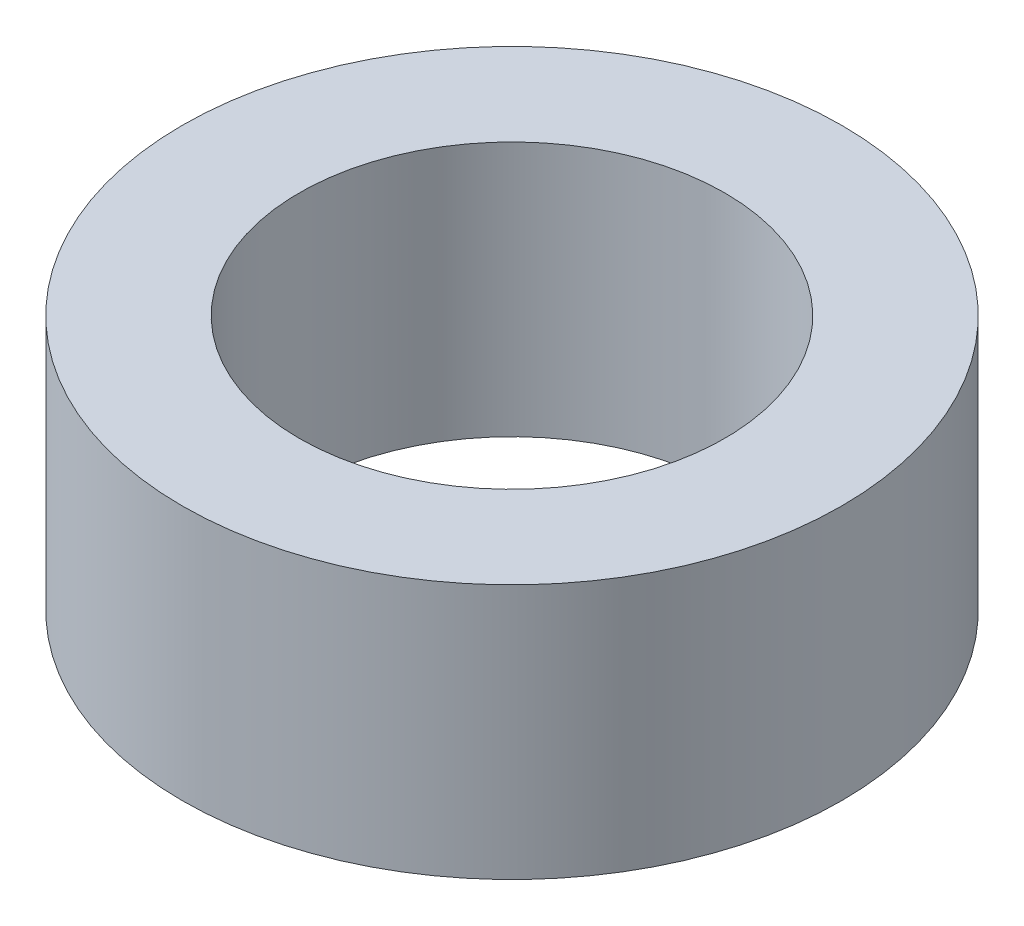
ISO-10303-21;
HEADER;
FILE_DESCRIPTION(('STEP AP214'),'2;1');
FILE_NAME('part.step','',(''),(''),'','','');
FILE_SCHEMA(('AUTOMOTIVE_DESIGN { 1 0 10303 214 1 1 1 1 }'));
ENDSEC;
DATA;
#1=APPLICATION_CONTEXT('core data for automotive mechanical design processes');
#2=APPLICATION_PROTOCOL_DEFINITION('international standard','automotive_design',2000,#1);
#3=PRODUCT_CONTEXT('',#1,'mechanical');
#4=PRODUCT('Part','Part','',(#3));
#5=PRODUCT_RELATED_PRODUCT_CATEGORY('part','',(#4));
#6=PRODUCT_DEFINITION_FORMATION('','',#4);
#7=PRODUCT_DEFINITION_CONTEXT('part definition',#1,'design');
#8=PRODUCT_DEFINITION('design','',#6,#7);
#9=PRODUCT_DEFINITION_SHAPE('','',#8);
#10=(LENGTH_UNIT() NAMED_UNIT(*) SI_UNIT(.MILLI.,.METRE.));
#11=(NAMED_UNIT(*) PLANE_ANGLE_UNIT() SI_UNIT($,.RADIAN.));
#12=(NAMED_UNIT(*) SI_UNIT($,.STERADIAN.) SOLID_ANGLE_UNIT());
#13=UNCERTAINTY_MEASURE_WITH_UNIT(LENGTH_MEASURE(1.E-05),#10,'distance_accuracy_value','');
#14=(GEOMETRIC_REPRESENTATION_CONTEXT(3) GLOBAL_UNCERTAINTY_ASSIGNED_CONTEXT((#13)) GLOBAL_UNIT_ASSIGNED_CONTEXT((#10,
#11,#12)) REPRESENTATION_CONTEXT('',''));
#15=CARTESIAN_POINT('',(0.,0.,0.));
#16=DIRECTION('',(0.,0.,1.));
#17=DIRECTION('',(1.,0.,0.));
#18=AXIS2_PLACEMENT_3D('',#15,#16,#17);
#19=CARTESIAN_POINT('',(0.,0.,0.));
#20=DIRECTION('',(0.,1.,0.));
#21=DIRECTION('',(0.,0.,1.));
#22=AXIS2_PLACEMENT_3D('',#19,#20,#21);
#23=CYLINDRICAL_SURFACE('',#22,2.5);
#24=CARTESIAN_POINT('',(0.,-1.5,0.));
#25=DIRECTION('',(0.,1.,0.));
#26=DIRECTION('',(0.,0.,1.));
#27=AXIS2_PLACEMENT_3D('',#24,#25,#26);
#28=CIRCLE('',#27,2.5);
#29=CARTESIAN_POINT('',(0.,-1.5,2.5));
#30=VERTEX_POINT('',#29);
#31=EDGE_CURVE('E26',#30,#30,#28,.F.);
#32=ORIENTED_EDGE('',*,*,#31,.T.);
#33=EDGE_LOOP('',(#32));
#34=FACE_BOUND('',#33,.T.);
#35=CARTESIAN_POINT('',(0.,1.5,0.));
#36=DIRECTION('',(0.,1.,0.));
#37=DIRECTION('',(0.,0.,1.));
#38=AXIS2_PLACEMENT_3D('',#35,#36,#37);
#39=CIRCLE('',#38,2.5);
#40=CARTESIAN_POINT('',(0.,1.5,2.5));
#41=VERTEX_POINT('',#40);
#42=EDGE_CURVE('E17',#41,#41,#39,.F.);
#43=ORIENTED_EDGE('',*,*,#42,.F.);
#44=EDGE_LOOP('',(#43));
#45=FACE_BOUND('',#44,.T.);
#46=ADVANCED_FACE('F14',(#34,#45),#23,.F.);
#47=CARTESIAN_POINT('',(0.,1.5,0.));
#48=DIRECTION('',(0.,1.,0.));
#49=DIRECTION('',(0.,0.,1.));
#50=AXIS2_PLACEMENT_3D('',#47,#48,#49);
#51=PLANE('',#50);
#52=ORIENTED_EDGE('',*,*,#42,.T.);
#53=EDGE_LOOP('',(#52));
#54=FACE_BOUND('',#53,.T.);
#55=CARTESIAN_POINT('',(0.,1.5,0.));
#56=DIRECTION('',(0.,1.,0.));
#57=DIRECTION('',(0.,0.,1.));
#58=AXIS2_PLACEMENT_3D('',#55,#56,#57);
#59=CIRCLE('',#58,3.875);
#60=CARTESIAN_POINT('',(0.,1.5,3.875));
#61=VERTEX_POINT('',#60);
#62=EDGE_CURVE('E21',#61,#61,#59,.F.);
#63=ORIENTED_EDGE('',*,*,#62,.F.);
#64=EDGE_LOOP('',(#63));
#65=FACE_BOUND('',#64,.T.);
#66=ADVANCED_FACE('F34',(#54,#65),#51,.T.);
#67=CARTESIAN_POINT('',(0.,-1.5,0.));
#68=DIRECTION('',(0.,1.,0.));
#69=DIRECTION('',(0.,0.,1.));
#70=AXIS2_PLACEMENT_3D('',#67,#68,#69);
#71=PLANE('',#70);
#72=ORIENTED_EDGE('',*,*,#31,.F.);
#73=EDGE_LOOP('',(#72));
#74=FACE_BOUND('',#73,.T.);
#75=CARTESIAN_POINT('',(0.,-1.5,0.));
#76=DIRECTION('',(0.,1.,0.));
#77=DIRECTION('',(0.,0.,1.));
#78=AXIS2_PLACEMENT_3D('',#75,#76,#77);
#79=CIRCLE('',#78,3.875);
#80=CARTESIAN_POINT('',(0.,-1.5,3.875));
#81=VERTEX_POINT('',#80);
#82=EDGE_CURVE('E10',#81,#81,#79,.T.);
#83=ORIENTED_EDGE('',*,*,#82,.F.);
#84=EDGE_LOOP('',(#83));
#85=FACE_BOUND('',#84,.T.);
#86=ADVANCED_FACE('F42',(#74,#85),#71,.F.);
#87=CARTESIAN_POINT('',(0.,0.,0.));
#88=DIRECTION('',(0.,1.,0.));
#89=DIRECTION('',(0.,0.,1.));
#90=AXIS2_PLACEMENT_3D('',#87,#88,#89);
#91=CYLINDRICAL_SURFACE('',#90,3.875);
#92=ORIENTED_EDGE('',*,*,#82,.T.);
#93=EDGE_LOOP('',(#92));
#94=FACE_BOUND('',#93,.T.);
#95=ORIENTED_EDGE('',*,*,#62,.T.);
#96=EDGE_LOOP('',(#95));
#97=FACE_BOUND('',#96,.T.);
#98=ADVANCED_FACE('F43',(#94,#97),#91,.T.);
#99=CLOSED_SHELL('',(#46,#66,#86,#98));
#100=MANIFOLD_SOLID_BREP('B1',#99);
#101=ADVANCED_BREP_SHAPE_REPRESENTATION('',(#18,#100),#14);
#102=SHAPE_DEFINITION_REPRESENTATION(#9,#101);
ENDSEC;
END-ISO-10303-21;
